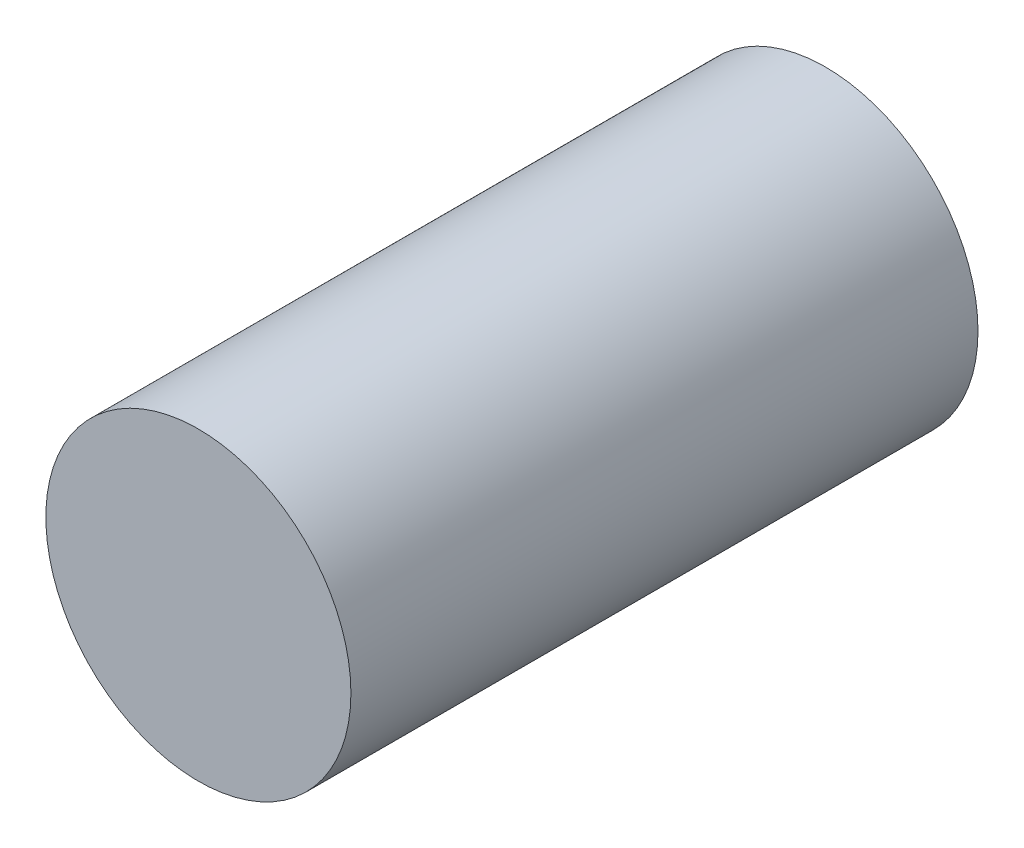
ISO-10303-21;
HEADER;
FILE_DESCRIPTION(('STEP AP214'),'2;1');
FILE_NAME('part.step','',(''),(''),'','','');
FILE_SCHEMA(('AUTOMOTIVE_DESIGN { 1 0 10303 214 1 1 1 1 }'));
ENDSEC;
DATA;
#1=APPLICATION_CONTEXT('core data for automotive mechanical design processes');
#2=APPLICATION_PROTOCOL_DEFINITION('international standard','automotive_design',2000,#1);
#3=PRODUCT_CONTEXT('',#1,'mechanical');
#4=PRODUCT('Part','Part','',(#3));
#5=PRODUCT_RELATED_PRODUCT_CATEGORY('part','',(#4));
#6=PRODUCT_DEFINITION_FORMATION('','',#4);
#7=PRODUCT_DEFINITION_CONTEXT('part definition',#1,'design');
#8=PRODUCT_DEFINITION('design','',#6,#7);
#9=PRODUCT_DEFINITION_SHAPE('','',#8);
#10=(LENGTH_UNIT() NAMED_UNIT(*) SI_UNIT(.MILLI.,.METRE.));
#11=(NAMED_UNIT(*) PLANE_ANGLE_UNIT() SI_UNIT($,.RADIAN.));
#12=(NAMED_UNIT(*) SI_UNIT($,.STERADIAN.) SOLID_ANGLE_UNIT());
#13=UNCERTAINTY_MEASURE_WITH_UNIT(LENGTH_MEASURE(1.E-05),#10,'distance_accuracy_value','');
#14=(GEOMETRIC_REPRESENTATION_CONTEXT(3) GLOBAL_UNCERTAINTY_ASSIGNED_CONTEXT((#13)) GLOBAL_UNIT_ASSIGNED_CONTEXT((#10,
#11,#12)) REPRESENTATION_CONTEXT('',''));
#15=CARTESIAN_POINT('',(0.,0.,0.));
#16=DIRECTION('',(0.,0.,1.));
#17=DIRECTION('',(1.,0.,0.));
#18=AXIS2_PLACEMENT_3D('',#15,#16,#17);
#19=CARTESIAN_POINT('',(0.,0.,-74.));
#20=DIRECTION('',(0.,0.,1.));
#21=DIRECTION('',(1.,0.,0.));
#22=AXIS2_PLACEMENT_3D('',#19,#20,#21);
#23=CYLINDRICAL_SURFACE('',#22,18.);
#24=CARTESIAN_POINT('',(0.,0.,-74.));
#25=DIRECTION('',(0.,0.,1.));
#26=DIRECTION('',(1.,0.,0.));
#27=AXIS2_PLACEMENT_3D('',#24,#25,#26);
#28=CIRCLE('',#27,18.);
#29=CARTESIAN_POINT('',(18.,0.,-74.));
#30=VERTEX_POINT('',#29);
#31=EDGE_CURVE('E10',#30,#30,#28,.T.);
#32=ORIENTED_EDGE('',*,*,#31,.T.);
#33=EDGE_LOOP('',(#32));
#34=FACE_BOUND('',#33,.T.);
#35=CARTESIAN_POINT('',(0.,0.,0.));
#36=DIRECTION('',(0.,0.,1.));
#37=DIRECTION('',(1.,0.,0.));
#38=AXIS2_PLACEMENT_3D('',#35,#36,#37);
#39=CIRCLE('',#38,18.);
#40=CARTESIAN_POINT('',(18.,0.,0.));
#41=VERTEX_POINT('',#40);
#42=EDGE_CURVE('E42',#41,#41,#39,.T.);
#43=ORIENTED_EDGE('',*,*,#42,.F.);
#44=EDGE_LOOP('',(#43));
#45=FACE_BOUND('',#44,.T.);
#46=ADVANCED_FACE('F39',(#34,#45),#23,.T.);
#47=CARTESIAN_POINT('',(0.,0.,-74.));
#48=DIRECTION('',(0.,0.,1.));
#49=DIRECTION('',(1.,0.,0.));
#50=AXIS2_PLACEMENT_3D('',#47,#48,#49);
#51=PLANE('',#50);
#52=ORIENTED_EDGE('',*,*,#31,.F.);
#53=EDGE_LOOP('',(#52));
#54=FACE_BOUND('',#53,.T.);
#55=ADVANCED_FACE('F54',(#54),#51,.F.);
#56=CARTESIAN_POINT('',(0.,0.,0.));
#57=DIRECTION('',(0.,0.,1.));
#58=DIRECTION('',(1.,0.,0.));
#59=AXIS2_PLACEMENT_3D('',#56,#57,#58);
#60=PLANE('',#59);
#61=ORIENTED_EDGE('',*,*,#42,.T.);
#62=EDGE_LOOP('',(#61));
#63=FACE_BOUND('',#62,.T.);
#64=ADVANCED_FACE('F51',(#63),#60,.T.);
#65=CLOSED_SHELL('',(#46,#55,#64));
#66=MANIFOLD_SOLID_BREP('B2',#65);
#67=ADVANCED_BREP_SHAPE_REPRESENTATION('',(#18,#66),#14);
#68=SHAPE_DEFINITION_REPRESENTATION(#9,#67);
ENDSEC;
END-ISO-10303-21;
